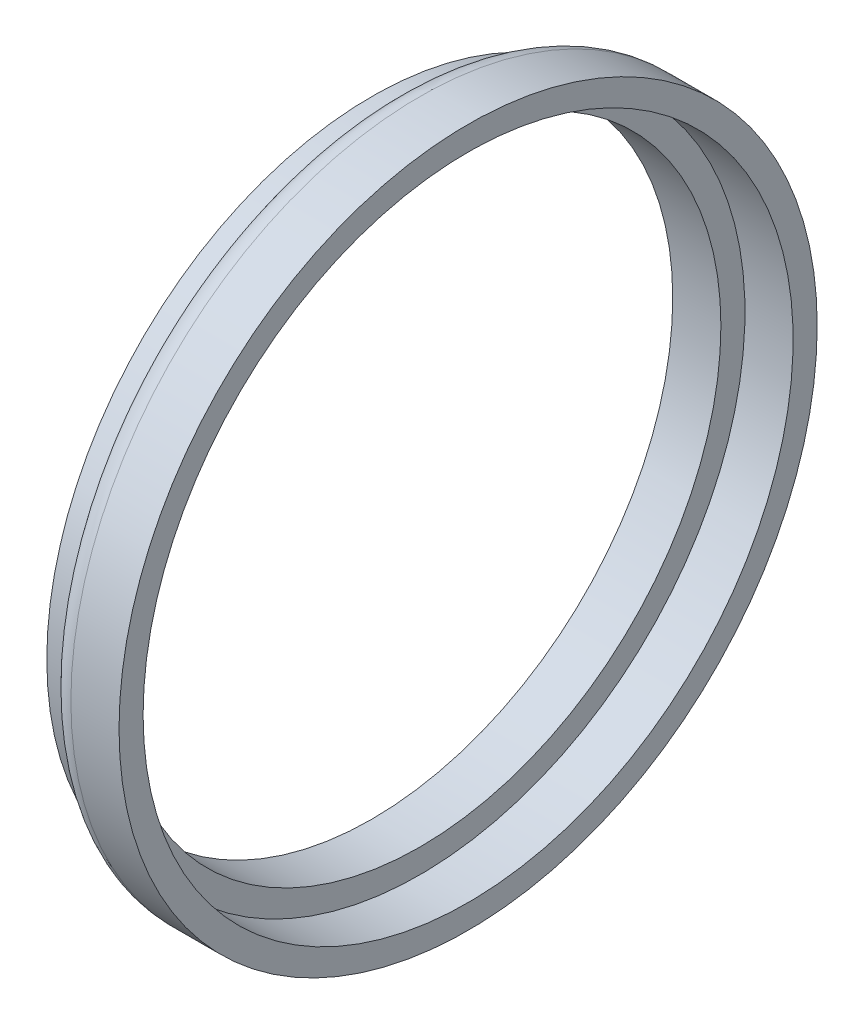
ISO-10303-21;
HEADER;
FILE_DESCRIPTION(('STEP AP214'),'2;1');
FILE_NAME('part.step','',(''),(''),'','','');
FILE_SCHEMA(('AUTOMOTIVE_DESIGN { 1 0 10303 214 1 1 1 1 }'));
ENDSEC;
DATA;
#1=APPLICATION_CONTEXT('core data for automotive mechanical design processes');
#2=APPLICATION_PROTOCOL_DEFINITION('international standard','automotive_design',2000,#1);
#3=PRODUCT_CONTEXT('',#1,'mechanical');
#4=PRODUCT('Part','Part','',(#3));
#5=PRODUCT_RELATED_PRODUCT_CATEGORY('part','',(#4));
#6=PRODUCT_DEFINITION_FORMATION('','',#4);
#7=PRODUCT_DEFINITION_CONTEXT('part definition',#1,'design');
#8=PRODUCT_DEFINITION('design','',#6,#7);
#9=PRODUCT_DEFINITION_SHAPE('','',#8);
#10=(LENGTH_UNIT() NAMED_UNIT(*) SI_UNIT(.MILLI.,.METRE.));
#11=(NAMED_UNIT(*) PLANE_ANGLE_UNIT() SI_UNIT($,.RADIAN.));
#12=(NAMED_UNIT(*) SI_UNIT($,.STERADIAN.) SOLID_ANGLE_UNIT());
#13=UNCERTAINTY_MEASURE_WITH_UNIT(LENGTH_MEASURE(1.E-05),#10,'distance_accuracy_value','');
#14=(GEOMETRIC_REPRESENTATION_CONTEXT(3) GLOBAL_UNCERTAINTY_ASSIGNED_CONTEXT((#13)) GLOBAL_UNIT_ASSIGNED_CONTEXT((#10,
#11,#12)) REPRESENTATION_CONTEXT('',''));
#15=CARTESIAN_POINT('',(0.,0.,0.));
#16=DIRECTION('',(0.,0.,1.));
#17=DIRECTION('',(1.,0.,0.));
#18=AXIS2_PLACEMENT_3D('',#15,#16,#17);
#19=CARTESIAN_POINT('',(-12.6770995448737,0.,0.));
#20=DIRECTION('',(-1.,0.,0.));
#21=DIRECTION('',(0.,0.,1.));
#22=AXIS2_PLACEMENT_3D('',#19,#20,#21);
#23=CYLINDRICAL_SURFACE('',#22,18.415);
#24=CARTESIAN_POINT('',(-2.54,0.,0.));
#25=DIRECTION('',(-1.,0.,0.));
#26=DIRECTION('',(0.,0.,1.));
#27=AXIS2_PLACEMENT_3D('',#24,#25,#26);
#28=CIRCLE('',#27,18.415);
#29=CARTESIAN_POINT('',(-2.54,0.,18.415));
#30=VERTEX_POINT('',#29);
#31=EDGE_CURVE('E10',#30,#30,#28,.T.);
#32=ORIENTED_EDGE('',*,*,#31,.F.);
#33=EDGE_LOOP('',(#32));
#34=FACE_BOUND('',#33,.T.);
#35=CARTESIAN_POINT('',(0.,0.,0.));
#36=DIRECTION('',(-1.,0.,0.));
#37=DIRECTION('',(0.,0.,1.));
#38=AXIS2_PLACEMENT_3D('',#35,#36,#37);
#39=CIRCLE('',#38,18.415);
#40=CARTESIAN_POINT('',(0.,0.,18.415));
#41=VERTEX_POINT('',#40);
#42=EDGE_CURVE('E58',#41,#41,#39,.T.);
#43=ORIENTED_EDGE('',*,*,#42,.T.);
#44=EDGE_LOOP('',(#43));
#45=FACE_BOUND('',#44,.T.);
#46=ADVANCED_FACE('F30',(#34,#45),#23,.T.);
#47=CARTESIAN_POINT('',(-2.54,0.,0.));
#48=DIRECTION('',(-1.,0.,0.));
#49=DIRECTION('',(0.,0.,1.));
#50=AXIS2_PLACEMENT_3D('',#47,#48,#49);
#51=TOROIDAL_SURFACE('',#50,17.145,1.27);
#52=CARTESIAN_POINT('',(-3.81,0.,0.));
#53=DIRECTION('',(-1.,0.,0.));
#54=DIRECTION('',(0.,0.,1.));
#55=AXIS2_PLACEMENT_3D('',#52,#53,#54);
#56=CIRCLE('',#55,17.145);
#57=CARTESIAN_POINT('',(-3.81,0.,17.145));
#58=VERTEX_POINT('',#57);
#59=EDGE_CURVE('E36',#58,#58,#56,.T.);
#60=ORIENTED_EDGE('',*,*,#59,.F.);
#61=EDGE_LOOP('',(#60));
#62=FACE_BOUND('',#61,.T.);
#63=ORIENTED_EDGE('',*,*,#31,.T.);
#64=EDGE_LOOP('',(#63));
#65=FACE_BOUND('',#64,.T.);
#66=ADVANCED_FACE('F81',(#62,#65),#51,.T.);
#67=CARTESIAN_POINT('',(-12.6770995448737,0.,0.));
#68=DIRECTION('',(-1.,0.,0.));
#69=DIRECTION('',(0.,0.,1.));
#70=AXIS2_PLACEMENT_3D('',#67,#68,#69);
#71=CYLINDRICAL_SURFACE('',#70,17.145);
#72=CARTESIAN_POINT('',(-5.08,0.,0.));
#73=DIRECTION('',(-1.,0.,0.));
#74=DIRECTION('',(0.,0.,1.));
#75=AXIS2_PLACEMENT_3D('',#72,#73,#74);
#76=CIRCLE('',#75,17.145);
#77=CARTESIAN_POINT('',(-5.08,0.,17.145));
#78=VERTEX_POINT('',#77);
#79=EDGE_CURVE('E40',#78,#78,#76,.T.);
#80=ORIENTED_EDGE('',*,*,#79,.F.);
#81=EDGE_LOOP('',(#80));
#82=FACE_BOUND('',#81,.T.);
#83=ORIENTED_EDGE('',*,*,#59,.T.);
#84=EDGE_LOOP('',(#83));
#85=FACE_BOUND('',#84,.T.);
#86=ADVANCED_FACE('F86',(#82,#85),#71,.T.);
#87=CARTESIAN_POINT('',(-5.08,0.,0.));
#88=DIRECTION('',(1.,0.,0.));
#89=DIRECTION('',(0.,0.,-1.));
#90=AXIS2_PLACEMENT_3D('',#87,#88,#89);
#91=PLANE('',#90);
#92=CARTESIAN_POINT('',(-5.08,0.,0.));
#93=DIRECTION('',(-1.,0.,0.));
#94=DIRECTION('',(0.,0.,1.));
#95=AXIS2_PLACEMENT_3D('',#92,#93,#94);
#96=CIRCLE('',#95,15.875);
#97=CARTESIAN_POINT('',(-5.08,0.,15.875));
#98=VERTEX_POINT('',#97);
#99=EDGE_CURVE('E44',#98,#98,#96,.T.);
#100=ORIENTED_EDGE('',*,*,#99,.F.);
#101=EDGE_LOOP('',(#100));
#102=FACE_BOUND('',#101,.T.);
#103=ORIENTED_EDGE('',*,*,#79,.T.);
#104=EDGE_LOOP('',(#103));
#105=FACE_BOUND('',#104,.T.);
#106=ADVANCED_FACE('F91',(#102,#105),#91,.F.);
#107=CARTESIAN_POINT('',(-12.6770995448737,0.,0.));
#108=DIRECTION('',(-1.,0.,0.));
#109=DIRECTION('',(0.,0.,1.));
#110=AXIS2_PLACEMENT_3D('',#107,#108,#109);
#111=CYLINDRICAL_SURFACE('',#110,15.875);
#112=ORIENTED_EDGE('',*,*,#99,.T.);
#113=EDGE_LOOP('',(#112));
#114=FACE_BOUND('',#113,.T.);
#115=CARTESIAN_POINT('',(-2.54,0.,0.));
#116=DIRECTION('',(-1.,0.,0.));
#117=DIRECTION('',(0.,0.,1.));
#118=AXIS2_PLACEMENT_3D('',#115,#116,#117);
#119=CIRCLE('',#118,15.875);
#120=CARTESIAN_POINT('',(-2.54,0.,15.875));
#121=VERTEX_POINT('',#120);
#122=EDGE_CURVE('E49',#121,#121,#119,.T.);
#123=ORIENTED_EDGE('',*,*,#122,.F.);
#124=EDGE_LOOP('',(#123));
#125=FACE_BOUND('',#124,.T.);
#126=ADVANCED_FACE('F77',(#114,#125),#111,.F.);
#127=CARTESIAN_POINT('',(-2.54,0.,0.));
#128=DIRECTION('',(1.,0.,0.));
#129=DIRECTION('',(0.,0.,-1.));
#130=AXIS2_PLACEMENT_3D('',#127,#128,#129);
#131=PLANE('',#130);
#132=ORIENTED_EDGE('',*,*,#122,.T.);
#133=EDGE_LOOP('',(#132));
#134=FACE_BOUND('',#133,.T.);
#135=CARTESIAN_POINT('',(-2.54,0.,0.));
#136=DIRECTION('',(-1.,0.,0.));
#137=DIRECTION('',(0.,0.,1.));
#138=AXIS2_PLACEMENT_3D('',#135,#136,#137);
#139=CIRCLE('',#138,17.145);
#140=CARTESIAN_POINT('',(-2.54,0.,17.145));
#141=VERTEX_POINT('',#140);
#142=EDGE_CURVE('E52',#141,#141,#139,.T.);
#143=ORIENTED_EDGE('',*,*,#142,.F.);
#144=EDGE_LOOP('',(#143));
#145=FACE_BOUND('',#144,.T.);
#146=ADVANCED_FACE('F71',(#134,#145),#131,.T.);
#147=CARTESIAN_POINT('',(-12.6770995448737,0.,0.));
#148=DIRECTION('',(-1.,0.,0.));
#149=DIRECTION('',(0.,0.,1.));
#150=AXIS2_PLACEMENT_3D('',#147,#148,#149);
#151=CYLINDRICAL_SURFACE('',#150,17.145);
#152=ORIENTED_EDGE('',*,*,#142,.T.);
#153=EDGE_LOOP('',(#152));
#154=FACE_BOUND('',#153,.T.);
#155=CARTESIAN_POINT('',(0.,0.,0.));
#156=DIRECTION('',(-1.,0.,0.));
#157=DIRECTION('',(0.,0.,1.));
#158=AXIS2_PLACEMENT_3D('',#155,#156,#157);
#159=CIRCLE('',#158,17.145);
#160=CARTESIAN_POINT('',(0.,0.,17.145));
#161=VERTEX_POINT('',#160);
#162=EDGE_CURVE('E55',#161,#161,#159,.T.);
#163=ORIENTED_EDGE('',*,*,#162,.F.);
#164=EDGE_LOOP('',(#163));
#165=FACE_BOUND('',#164,.T.);
#166=ADVANCED_FACE('F66',(#154,#165),#151,.F.);
#167=CARTESIAN_POINT('',(0.,0.,0.));
#168=DIRECTION('',(-1.,0.,0.));
#169=DIRECTION('',(0.,0.,1.));
#170=AXIS2_PLACEMENT_3D('',#167,#168,#169);
#171=PLANE('',#170);
#172=ORIENTED_EDGE('',*,*,#42,.F.);
#173=EDGE_LOOP('',(#172));
#174=FACE_BOUND('',#173,.T.);
#175=ORIENTED_EDGE('',*,*,#162,.T.);
#176=EDGE_LOOP('',(#175));
#177=FACE_BOUND('',#176,.T.);
#178=ADVANCED_FACE('F63',(#174,#177),#171,.F.);
#179=CLOSED_SHELL('',(#46,#66,#86,#106,#126,#146,#166,#178));
#180=MANIFOLD_SOLID_BREP('B2',#179);
#181=ADVANCED_BREP_SHAPE_REPRESENTATION('',(#18,#180),#14);
#182=SHAPE_DEFINITION_REPRESENTATION(#9,#181);
ENDSEC;
END-ISO-10303-21;
